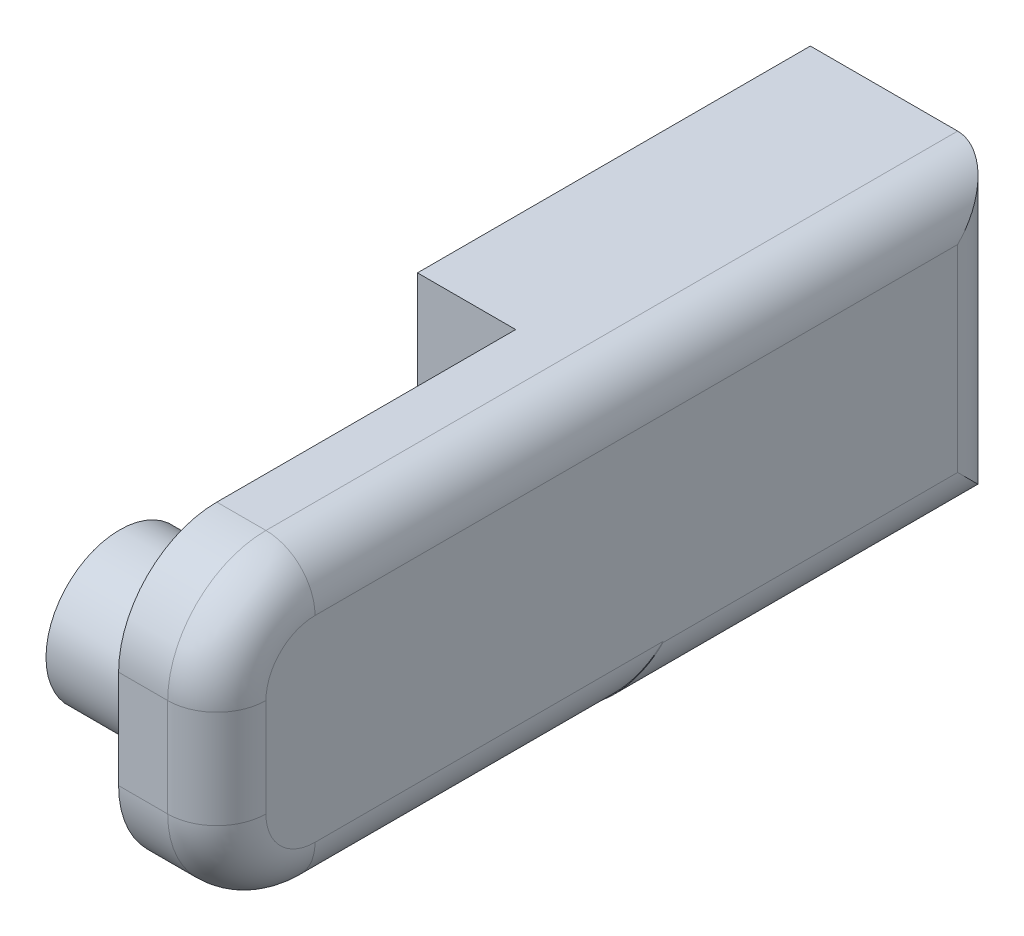
ISO-10303-21;
HEADER;
FILE_DESCRIPTION(('STEP AP214'),'2;1');
FILE_NAME('part.step','',(''),(''),'','','');
FILE_SCHEMA(('AUTOMOTIVE_DESIGN { 1 0 10303 214 1 1 1 1 }'));
ENDSEC;
DATA;
#1=APPLICATION_CONTEXT('core data for automotive mechanical design processes');
#2=APPLICATION_PROTOCOL_DEFINITION('international standard','automotive_design',2000,#1);
#3=PRODUCT_CONTEXT('',#1,'mechanical');
#4=PRODUCT('Part','Part','',(#3));
#5=PRODUCT_RELATED_PRODUCT_CATEGORY('part','',(#4));
#6=PRODUCT_DEFINITION_FORMATION('','',#4);
#7=PRODUCT_DEFINITION_CONTEXT('part definition',#1,'design');
#8=PRODUCT_DEFINITION('design','',#6,#7);
#9=PRODUCT_DEFINITION_SHAPE('','',#8);
#10=(LENGTH_UNIT() NAMED_UNIT(*) SI_UNIT(.MILLI.,.METRE.));
#11=(NAMED_UNIT(*) PLANE_ANGLE_UNIT() SI_UNIT($,.RADIAN.));
#12=(NAMED_UNIT(*) SI_UNIT($,.STERADIAN.) SOLID_ANGLE_UNIT());
#13=UNCERTAINTY_MEASURE_WITH_UNIT(LENGTH_MEASURE(1.E-05),#10,'distance_accuracy_value','');
#14=(GEOMETRIC_REPRESENTATION_CONTEXT(3) GLOBAL_UNCERTAINTY_ASSIGNED_CONTEXT((#13)) GLOBAL_UNIT_ASSIGNED_CONTEXT((#10,
#11,#12)) REPRESENTATION_CONTEXT('',''));
#15=CARTESIAN_POINT('',(0.,0.,0.));
#16=DIRECTION('',(0.,0.,1.));
#17=DIRECTION('',(1.,0.,0.));
#18=AXIS2_PLACEMENT_3D('',#15,#16,#17);
#19=CARTESIAN_POINT('',(-20.,0.,10.1076923076923));
#20=DIRECTION('',(1.,0.,0.));
#21=DIRECTION('',(0.,0.,-1.));
#22=AXIS2_PLACEMENT_3D('',#19,#20,#21);
#23=CYLINDRICAL_SURFACE('',#22,7.5);
#24=CARTESIAN_POINT('',(0.,0.,10.1076923076923));
#25=DIRECTION('',(1.,0.,0.));
#26=DIRECTION('',(0.,0.,-1.));
#27=AXIS2_PLACEMENT_3D('',#24,#25,#26);
#28=CIRCLE('',#27,7.5);
#29=CARTESIAN_POINT('',(0.,0.,2.60769230769231));
#30=VERTEX_POINT('',#29);
#31=EDGE_CURVE('E184',#30,#30,#28,.F.);
#32=ORIENTED_EDGE('',*,*,#31,.T.);
#33=EDGE_LOOP('',(#32));
#34=FACE_BOUND('',#33,.T.);
#35=CARTESIAN_POINT('',(-10.,0.,10.1076923076923));
#36=DIRECTION('',(-1.,0.,0.));
#37=DIRECTION('',(0.,0.,1.));
#38=AXIS2_PLACEMENT_3D('',#35,#36,#37);
#39=CIRCLE('',#38,7.5);
#40=CARTESIAN_POINT('',(-10.,0.,17.6076923076923));
#41=VERTEX_POINT('',#40);
#42=EDGE_CURVE('E151',#41,#41,#39,.T.);
#43=ORIENTED_EDGE('',*,*,#42,.F.);
#44=EDGE_LOOP('',(#43));
#45=FACE_BOUND('',#44,.T.);
#46=ADVANCED_FACE('F35',(#34,#45),#23,.T.);
#47=CARTESIAN_POINT('',(10.,15.,20.2153846153846));
#48=DIRECTION('',(0.,-1.,0.));
#49=DIRECTION('',(0.,0.,-1.));
#50=AXIS2_PLACEMENT_3D('',#47,#48,#49);
#51=PLANE('',#50);
#52=DIRECTION('',(-1.,0.,0.));
#53=VECTOR('',#52,1.);
#54=CARTESIAN_POINT('',(10.,15.,10.2153846153846));
#55=LINE('',#54,#53);
#56=CARTESIAN_POINT('',(0.,15.,10.2153846153846));
#57=VERTEX_POINT('',#56);
#58=CARTESIAN_POINT('',(5.,15.,10.2153846153846));
#59=VERTEX_POINT('',#58);
#60=EDGE_CURVE('E197',#57,#59,#55,.F.);
#61=ORIENTED_EDGE('',*,*,#60,.T.);
#62=DIRECTION('',(0.,0.,1.));
#63=VECTOR('',#62,1.);
#64=CARTESIAN_POINT('',(5.,15.,-60.2153846153846));
#65=LINE('',#64,#63);
#66=CARTESIAN_POINT('',(5.,15.,-60.2153846153846));
#67=VERTEX_POINT('',#66);
#68=EDGE_CURVE('E220',#59,#67,#65,.F.);
#69=ORIENTED_EDGE('',*,*,#68,.T.);
#70=DIRECTION('',(1.,0.,0.));
#71=VECTOR('',#70,1.);
#72=CARTESIAN_POINT('',(10.,15.,-60.2153846153846));
#73=LINE('',#72,#71);
#74=CARTESIAN_POINT('',(-10.,15.,-60.2153846153846));
#75=VERTEX_POINT('',#74);
#76=EDGE_CURVE('E157',#75,#67,#73,.T.);
#77=ORIENTED_EDGE('',*,*,#76,.F.);
#78=DIRECTION('',(0.,0.,1.));
#79=VECTOR('',#78,1.);
#80=CARTESIAN_POINT('',(-10.,15.,-60.2153846153846));
#81=LINE('',#80,#79);
#82=CARTESIAN_POINT('',(-10.,15.,-20.2153846153846));
#83=VERTEX_POINT('',#82);
#84=EDGE_CURVE('E152',#75,#83,#81,.T.);
#85=ORIENTED_EDGE('',*,*,#84,.T.);
#86=DIRECTION('',(1.,0.,0.));
#87=VECTOR('',#86,1.);
#88=CARTESIAN_POINT('',(10.,15.,-20.2153846153846));
#89=LINE('',#88,#87);
#90=CARTESIAN_POINT('',(0.,15.,-20.2153846153846));
#91=VERTEX_POINT('',#90);
#92=EDGE_CURVE('E142',#83,#91,#89,.T.);
#93=ORIENTED_EDGE('',*,*,#92,.T.);
#94=DIRECTION('',(0.,0.,1.));
#95=VECTOR('',#94,1.);
#96=CARTESIAN_POINT('',(0.,15.,20.2153846153846));
#97=LINE('',#96,#95);
#98=EDGE_CURVE('E173',#91,#57,#97,.T.);
#99=ORIENTED_EDGE('',*,*,#98,.T.);
#100=EDGE_LOOP('',(#61,#69,#77,#85,#93,#99));
#101=FACE_BOUND('',#100,.T.);
#102=ADVANCED_FACE('F270',(#101),#51,.F.);
#103=CARTESIAN_POINT('',(10.,15.,20.2153846153846));
#104=DIRECTION('',(0.,0.,-1.));
#105=DIRECTION('',(-1.,0.,0.));
#106=AXIS2_PLACEMENT_3D('',#103,#104,#105);
#107=PLANE('',#106);
#108=DIRECTION('',(-1.,0.,0.));
#109=VECTOR('',#108,1.);
#110=CARTESIAN_POINT('',(10.,-5.,20.2153846153846));
#111=LINE('',#110,#109);
#112=CARTESIAN_POINT('',(0.,-5.,20.2153846153846));
#113=VERTEX_POINT('',#112);
#114=CARTESIAN_POINT('',(5.,-5.,20.2153846153846));
#115=VERTEX_POINT('',#114);
#116=EDGE_CURVE('E195',#113,#115,#111,.F.);
#117=ORIENTED_EDGE('',*,*,#116,.T.);
#118=DIRECTION('',(0.,-1.,0.));
#119=VECTOR('',#118,1.);
#120=CARTESIAN_POINT('',(5.,5.,20.2153846153846));
#121=LINE('',#120,#119);
#122=CARTESIAN_POINT('',(5.,5.,20.2153846153846));
#123=VERTEX_POINT('',#122);
#124=EDGE_CURVE('E11',#115,#123,#121,.F.);
#125=ORIENTED_EDGE('',*,*,#124,.T.);
#126=DIRECTION('',(-1.,0.,0.));
#127=VECTOR('',#126,1.);
#128=CARTESIAN_POINT('',(10.,5.,20.2153846153846));
#129=LINE('',#128,#127);
#130=CARTESIAN_POINT('',(0.,5.,20.2153846153846));
#131=VERTEX_POINT('',#130);
#132=EDGE_CURVE('E193',#123,#131,#129,.T.);
#133=ORIENTED_EDGE('',*,*,#132,.T.);
#134=DIRECTION('',(0.,-1.,0.));
#135=VECTOR('',#134,1.);
#136=CARTESIAN_POINT('',(0.,15.,20.2153846153846));
#137=LINE('',#136,#135);
#138=EDGE_CURVE('E176',#131,#113,#137,.T.);
#139=ORIENTED_EDGE('',*,*,#138,.T.);
#140=EDGE_LOOP('',(#117,#125,#133,#139));
#141=FACE_BOUND('',#140,.T.);
#142=ADVANCED_FACE('F297',(#141),#107,.F.);
#143=CARTESIAN_POINT('',(10.,-15.,20.2153846153846));
#144=DIRECTION('',(0.,1.,0.));
#145=DIRECTION('',(0.,0.,1.));
#146=AXIS2_PLACEMENT_3D('',#143,#144,#145);
#147=PLANE('',#146);
#148=DIRECTION('',(-1.,0.,0.));
#149=VECTOR('',#148,1.);
#150=CARTESIAN_POINT('',(10.,-15.,-20.2153846153846));
#151=LINE('',#150,#149);
#152=CARTESIAN_POINT('',(5.,-15.,-20.2153846153846));
#153=VERTEX_POINT('',#152);
#154=CARTESIAN_POINT('',(0.,-15.,-20.2153846153846));
#155=VERTEX_POINT('',#154);
#156=EDGE_CURVE('E182',#153,#155,#151,.T.);
#157=ORIENTED_EDGE('',*,*,#156,.F.);
#158=DIRECTION('',(0.,0.,-1.));
#159=VECTOR('',#158,1.);
#160=CARTESIAN_POINT('',(5.,-15.,10.2153846153846));
#161=LINE('',#160,#159);
#162=CARTESIAN_POINT('',(5.,-15.,10.2153846153846));
#163=VERTEX_POINT('',#162);
#164=EDGE_CURVE('E59',#153,#163,#161,.F.);
#165=ORIENTED_EDGE('',*,*,#164,.T.);
#166=DIRECTION('',(-1.,0.,0.));
#167=VECTOR('',#166,1.);
#168=CARTESIAN_POINT('',(10.,-15.,10.2153846153846));
#169=LINE('',#168,#167);
#170=CARTESIAN_POINT('',(0.,-15.,10.2153846153846));
#171=VERTEX_POINT('',#170);
#172=EDGE_CURVE('E187',#163,#171,#169,.T.);
#173=ORIENTED_EDGE('',*,*,#172,.T.);
#174=DIRECTION('',(0.,0.,-1.));
#175=VECTOR('',#174,1.);
#176=CARTESIAN_POINT('',(0.,-15.,20.2153846153846));
#177=LINE('',#176,#175);
#178=EDGE_CURVE('E179',#171,#155,#177,.T.);
#179=ORIENTED_EDGE('',*,*,#178,.T.);
#180=EDGE_LOOP('',(#157,#165,#173,#179));
#181=FACE_BOUND('',#180,.T.);
#182=ADVANCED_FACE('F262',(#181),#147,.F.);
#183=CARTESIAN_POINT('',(10.,0.,0.));
#184=DIRECTION('',(1.,0.,0.));
#185=DIRECTION('',(0.,0.,-1.));
#186=AXIS2_PLACEMENT_3D('',#183,#184,#185);
#187=PLANE('',#186);
#188=DIRECTION('',(0.,0.,1.));
#189=VECTOR('',#188,1.);
#190=CARTESIAN_POINT('',(10.,10.,10.2153846153846));
#191=LINE('',#190,#189);
#192=CARTESIAN_POINT('',(10.,10.,-55.2153846153846));
#193=VERTEX_POINT('',#192);
#194=CARTESIAN_POINT('',(10.,10.,10.2153846153846));
#195=VERTEX_POINT('',#194);
#196=EDGE_CURVE('E212',#193,#195,#191,.T.);
#197=ORIENTED_EDGE('',*,*,#196,.T.);
#198=CARTESIAN_POINT('',(10.,5.,10.2153846153846));
#199=DIRECTION('',(1.,0.,0.));
#200=DIRECTION('',(0.,0.,-1.));
#201=AXIS2_PLACEMENT_3D('',#198,#199,#200);
#202=CIRCLE('',#201,5.);
#203=CARTESIAN_POINT('',(10.,5.,15.2153846153846));
#204=VERTEX_POINT('',#203);
#205=EDGE_CURVE('E214',#195,#204,#202,.T.);
#206=ORIENTED_EDGE('',*,*,#205,.T.);
#207=DIRECTION('',(0.,-1.,0.));
#208=VECTOR('',#207,1.);
#209=CARTESIAN_POINT('',(10.,-5.,15.2153846153846));
#210=LINE('',#209,#208);
#211=CARTESIAN_POINT('',(10.,-5.,15.2153846153846));
#212=VERTEX_POINT('',#211);
#213=EDGE_CURVE('E200',#204,#212,#210,.T.);
#214=ORIENTED_EDGE('',*,*,#213,.T.);
#215=CARTESIAN_POINT('',(10.,-5.,10.2153846153846));
#216=DIRECTION('',(1.,0.,0.));
#217=DIRECTION('',(0.,0.,-1.));
#218=AXIS2_PLACEMENT_3D('',#215,#216,#217);
#219=CIRCLE('',#218,5.);
#220=CARTESIAN_POINT('',(10.,-10.,10.2153846153846));
#221=VERTEX_POINT('',#220);
#222=EDGE_CURVE('E202',#212,#221,#219,.T.);
#223=ORIENTED_EDGE('',*,*,#222,.T.);
#224=DIRECTION('',(0.,0.,-1.));
#225=VECTOR('',#224,1.);
#226=CARTESIAN_POINT('',(10.,-10.,-20.2153846153846));
#227=LINE('',#226,#225);
#228=CARTESIAN_POINT('',(10.,-10.,-25.2153846153846));
#229=VERTEX_POINT('',#228);
#230=EDGE_CURVE('E204',#221,#229,#227,.T.);
#231=ORIENTED_EDGE('',*,*,#230,.T.);
#232=DIRECTION('',(0.,-1.,0.));
#233=VECTOR('',#232,1.);
#234=CARTESIAN_POINT('',(10.,-15.1023626646417,-25.2153846153846));
#235=LINE('',#234,#233);
#236=CARTESIAN_POINT('',(10.,-10.1023626646417,-25.2153846153846));
#237=VERTEX_POINT('',#236);
#238=EDGE_CURVE('E206',#229,#237,#235,.T.);
#239=ORIENTED_EDGE('',*,*,#238,.T.);
#240=DIRECTION('',(0.,0.,1.));
#241=VECTOR('',#240,1.);
#242=CARTESIAN_POINT('',(10.,-10.1023626646417,-60.2153846153846));
#243=LINE('',#242,#241);
#244=CARTESIAN_POINT('',(10.,-10.1023626646417,-55.2153846153846));
#245=VERTEX_POINT('',#244);
#246=EDGE_CURVE('E208',#237,#245,#243,.F.);
#247=ORIENTED_EDGE('',*,*,#246,.T.);
#248=DIRECTION('',(0.,-1.,0.));
#249=VECTOR('',#248,1.);
#250=CARTESIAN_POINT('',(10.,0.,-55.2153846153846));
#251=LINE('',#250,#249);
#252=EDGE_CURVE('E210',#245,#193,#251,.F.);
#253=ORIENTED_EDGE('',*,*,#252,.T.);
#254=EDGE_LOOP('',(#197,#206,#214,#223,#231,#239,#247,#253));
#255=FACE_BOUND('',#254,.T.);
#256=ADVANCED_FACE('F283',(#255),#187,.T.);
#257=CARTESIAN_POINT('',(0.,0.,0.));
#258=DIRECTION('',(1.,0.,0.));
#259=DIRECTION('',(0.,0.,-1.));
#260=AXIS2_PLACEMENT_3D('',#257,#258,#259);
#261=PLANE('',#260);
#262=ORIENTED_EDGE('',*,*,#31,.F.);
#263=EDGE_LOOP('',(#262));
#264=FACE_BOUND('',#263,.T.);
#265=ORIENTED_EDGE('',*,*,#178,.F.);
#266=CARTESIAN_POINT('',(0.,-5.,10.2153846153846));
#267=DIRECTION('',(1.,0.,0.));
#268=DIRECTION('',(0.,0.,-1.));
#269=AXIS2_PLACEMENT_3D('',#266,#267,#268);
#270=CIRCLE('',#269,10.);
#271=EDGE_CURVE('E191',#171,#113,#270,.F.);
#272=ORIENTED_EDGE('',*,*,#271,.T.);
#273=ORIENTED_EDGE('',*,*,#138,.F.);
#274=CARTESIAN_POINT('',(0.,5.,10.2153846153846));
#275=DIRECTION('',(1.,0.,0.));
#276=DIRECTION('',(0.,0.,-1.));
#277=AXIS2_PLACEMENT_3D('',#274,#275,#276);
#278=CIRCLE('',#277,10.);
#279=EDGE_CURVE('E189',#131,#57,#278,.F.);
#280=ORIENTED_EDGE('',*,*,#279,.T.);
#281=ORIENTED_EDGE('',*,*,#98,.F.);
#282=DIRECTION('',(0.,1.,0.));
#283=VECTOR('',#282,1.);
#284=CARTESIAN_POINT('',(0.,15.,-20.2153846153846));
#285=LINE('',#284,#283);
#286=EDGE_CURVE('E170',#155,#91,#285,.T.);
#287=ORIENTED_EDGE('',*,*,#286,.F.);
#288=EDGE_LOOP('',(#265,#272,#273,#280,#281,#287));
#289=FACE_BOUND('',#288,.T.);
#290=ADVANCED_FACE('F266',(#264,#289),#261,.F.);
#291=CARTESIAN_POINT('',(10.,-5.,10.2153846153846));
#292=DIRECTION('',(-1.,0.,0.));
#293=DIRECTION('',(0.,0.,1.));
#294=AXIS2_PLACEMENT_3D('',#291,#292,#293);
#295=CYLINDRICAL_SURFACE('',#294,10.);
#296=ORIENTED_EDGE('',*,*,#172,.F.);
#297=CARTESIAN_POINT('',(5.,-5.,10.2153846153846));
#298=DIRECTION('',(1.,0.,0.));
#299=DIRECTION('',(0.,0.,-1.));
#300=AXIS2_PLACEMENT_3D('',#297,#298,#299);
#301=CIRCLE('',#300,10.);
#302=EDGE_CURVE('E44',#163,#115,#301,.F.);
#303=ORIENTED_EDGE('',*,*,#302,.T.);
#304=ORIENTED_EDGE('',*,*,#116,.F.);
#305=ORIENTED_EDGE('',*,*,#271,.F.);
#306=EDGE_LOOP('',(#296,#303,#304,#305));
#307=FACE_BOUND('',#306,.T.);
#308=ADVANCED_FACE('F333',(#307),#295,.T.);
#309=CARTESIAN_POINT('',(10.,5.,10.2153846153846));
#310=DIRECTION('',(-1.,0.,0.));
#311=DIRECTION('',(0.,0.,1.));
#312=AXIS2_PLACEMENT_3D('',#309,#310,#311);
#313=CYLINDRICAL_SURFACE('',#312,10.);
#314=ORIENTED_EDGE('',*,*,#132,.F.);
#315=CARTESIAN_POINT('',(5.,5.,10.2153846153846));
#316=DIRECTION('',(1.,0.,0.));
#317=DIRECTION('',(0.,0.,-1.));
#318=AXIS2_PLACEMENT_3D('',#315,#316,#317);
#319=CIRCLE('',#318,10.);
#320=EDGE_CURVE('E217',#123,#59,#319,.F.);
#321=ORIENTED_EDGE('',*,*,#320,.T.);
#322=ORIENTED_EDGE('',*,*,#60,.F.);
#323=ORIENTED_EDGE('',*,*,#279,.F.);
#324=EDGE_LOOP('',(#314,#321,#322,#323));
#325=FACE_BOUND('',#324,.T.);
#326=ADVANCED_FACE('F301',(#325),#313,.T.);
#327=CARTESIAN_POINT('',(-10.,0.,10.1076923076923));
#328=DIRECTION('',(-1.,0.,0.));
#329=DIRECTION('',(0.,0.,1.));
#330=AXIS2_PLACEMENT_3D('',#327,#328,#329);
#331=PLANE('',#330);
#332=ORIENTED_EDGE('',*,*,#42,.T.);
#333=EDGE_LOOP('',(#332));
#334=FACE_BOUND('',#333,.T.);
#335=ADVANCED_FACE('F327',(#334),#331,.T.);
#336=CARTESIAN_POINT('',(0.,0.,-20.2153846153846));
#337=DIRECTION('',(0.,0.,-1.));
#338=DIRECTION('',(-1.,0.,0.));
#339=AXIS2_PLACEMENT_3D('',#336,#337,#338);
#340=PLANE('',#339);
#341=DIRECTION('',(-1.,0.,0.));
#342=VECTOR('',#341,1.);
#343=CARTESIAN_POINT('',(10.,-15.1023626646417,-20.2153846153846));
#344=LINE('',#343,#342);
#345=CARTESIAN_POINT('',(5.,-15.1023626646417,-20.2153846153846));
#346=VERTEX_POINT('',#345);
#347=CARTESIAN_POINT('',(-10.,-15.1023626646417,-20.2153846153846));
#348=VERTEX_POINT('',#347);
#349=EDGE_CURVE('E148',#346,#348,#344,.T.);
#350=ORIENTED_EDGE('',*,*,#349,.F.);
#351=DIRECTION('',(0.,-1.,0.));
#352=VECTOR('',#351,1.);
#353=CARTESIAN_POINT('',(5.,-15.,-20.2153846153846));
#354=LINE('',#353,#352);
#355=EDGE_CURVE('E225',#346,#153,#354,.F.);
#356=ORIENTED_EDGE('',*,*,#355,.T.);
#357=ORIENTED_EDGE('',*,*,#156,.T.);
#358=ORIENTED_EDGE('',*,*,#286,.T.);
#359=ORIENTED_EDGE('',*,*,#92,.F.);
#360=DIRECTION('',(0.,1.,0.));
#361=VECTOR('',#360,1.);
#362=CARTESIAN_POINT('',(-10.,15.,-20.2153846153846));
#363=LINE('',#362,#361);
#364=EDGE_CURVE('E163',#348,#83,#363,.T.);
#365=ORIENTED_EDGE('',*,*,#364,.F.);
#366=EDGE_LOOP('',(#350,#356,#357,#358,#359,#365));
#367=FACE_BOUND('',#366,.T.);
#368=ADVANCED_FACE('F260',(#367),#340,.F.);
#369=CARTESIAN_POINT('',(10.,-15.1023626646417,-60.2153846153846));
#370=DIRECTION('',(0.,1.,0.));
#371=DIRECTION('',(0.,0.,1.));
#372=AXIS2_PLACEMENT_3D('',#369,#370,#371);
#373=PLANE('',#372);
#374=DIRECTION('',(-1.,0.,0.));
#375=VECTOR('',#374,1.);
#376=CARTESIAN_POINT('',(10.,-15.1023626646417,-60.2153846153846));
#377=LINE('',#376,#375);
#378=CARTESIAN_POINT('',(5.,-15.1023626646417,-60.2153846153846));
#379=VERTEX_POINT('',#378);
#380=CARTESIAN_POINT('',(-10.,-15.1023626646417,-60.2153846153846));
#381=VERTEX_POINT('',#380);
#382=EDGE_CURVE('E131',#379,#381,#377,.T.);
#383=ORIENTED_EDGE('',*,*,#382,.F.);
#384=DIRECTION('',(0.,0.,1.));
#385=VECTOR('',#384,1.);
#386=CARTESIAN_POINT('',(5.,-15.1023626646417,-20.2153846153846));
#387=LINE('',#386,#385);
#388=EDGE_CURVE('E223',#379,#346,#387,.T.);
#389=ORIENTED_EDGE('',*,*,#388,.T.);
#390=ORIENTED_EDGE('',*,*,#349,.T.);
#391=DIRECTION('',(0.,0.,1.));
#392=VECTOR('',#391,1.);
#393=CARTESIAN_POINT('',(-10.,-15.1023626646417,-60.2153846153846));
#394=LINE('',#393,#392);
#395=EDGE_CURVE('E145',#381,#348,#394,.T.);
#396=ORIENTED_EDGE('',*,*,#395,.F.);
#397=EDGE_LOOP('',(#383,#389,#390,#396));
#398=FACE_BOUND('',#397,.T.);
#399=ADVANCED_FACE('F146',(#398),#373,.F.);
#400=CARTESIAN_POINT('',(-10.,15.,-60.2153846153846));
#401=DIRECTION('',(1.,0.,0.));
#402=DIRECTION('',(0.,1.,0.));
#403=AXIS2_PLACEMENT_3D('',#400,#401,#402);
#404=PLANE('',#403);
#405=ORIENTED_EDGE('',*,*,#364,.T.);
#406=ORIENTED_EDGE('',*,*,#84,.F.);
#407=DIRECTION('',(0.,1.,0.));
#408=VECTOR('',#407,1.);
#409=CARTESIAN_POINT('',(-10.,15.,-60.2153846153846));
#410=LINE('',#409,#408);
#411=EDGE_CURVE('E136',#381,#75,#410,.T.);
#412=ORIENTED_EDGE('',*,*,#411,.F.);
#413=ORIENTED_EDGE('',*,*,#395,.T.);
#414=EDGE_LOOP('',(#405,#406,#412,#413));
#415=FACE_BOUND('',#414,.T.);
#416=ADVANCED_FACE('F154',(#415),#404,.F.);
#417=CARTESIAN_POINT('',(0.,0.,-60.2153846153846));
#418=DIRECTION('',(0.,0.,-1.));
#419=DIRECTION('',(-1.,0.,0.));
#420=AXIS2_PLACEMENT_3D('',#417,#418,#419);
#421=PLANE('',#420);
#422=CARTESIAN_POINT('',(-2.5,-0.0511813323208349,-60.2153846153846));
#423=DIRECTION('',(0.,0.,-1.));
#424=DIRECTION('',(-1.,0.,0.));
#425=AXIS2_PLACEMENT_3D('',#422,#423,#424);
#426=CIRCLE('',#425,5.);
#427=CARTESIAN_POINT('',(-7.5,-0.0511813323208349,-60.2153846153846));
#428=VERTEX_POINT('',#427);
#429=EDGE_CURVE('E364',#428,#428,#426,.T.);
#430=ORIENTED_EDGE('',*,*,#429,.F.);
#431=EDGE_LOOP('',(#430));
#432=FACE_BOUND('',#431,.T.);
#433=ORIENTED_EDGE('',*,*,#76,.T.);
#434=DIRECTION('',(0.,-1.,0.));
#435=VECTOR('',#434,1.);
#436=CARTESIAN_POINT('',(5.,0.,-60.2153846153846));
#437=LINE('',#436,#435);
#438=EDGE_CURVE('E139',#67,#379,#437,.T.);
#439=ORIENTED_EDGE('',*,*,#438,.T.);
#440=ORIENTED_EDGE('',*,*,#382,.T.);
#441=ORIENTED_EDGE('',*,*,#411,.T.);
#442=EDGE_LOOP('',(#433,#439,#440,#441));
#443=FACE_BOUND('',#442,.T.);
#444=ADVANCED_FACE('F134',(#432,#443),#421,.T.);
#445=CARTESIAN_POINT('',(5.,0.,-25.2153846153846));
#446=DIRECTION('',(0.,1.,0.));
#447=DIRECTION('',(0.,0.,1.));
#448=AXIS2_PLACEMENT_3D('',#445,#446,#447);
#449=CYLINDRICAL_SURFACE('',#448,5.);
#450=CARTESIAN_POINT('',(5.,-10.,-25.2153846153846));
#451=DIRECTION('',(0.,0.707106781186547,0.707106781186547));
#452=DIRECTION('',(0.,0.707106781186547,-0.707106781186547));
#453=AXIS2_PLACEMENT_3D('',#450,#451,#452);
#454=ELLIPSE('',#453,7.07106781186547,5.);
#455=EDGE_CURVE('E245',#153,#229,#454,.T.);
#456=ORIENTED_EDGE('',*,*,#455,.F.);
#457=ORIENTED_EDGE('',*,*,#355,.F.);
#458=CARTESIAN_POINT('',(5.,-10.1023626646417,-25.2153846153846));
#459=DIRECTION('',(0.,0.707106781186547,0.707106781186547));
#460=DIRECTION('',(0.,0.707106781186547,-0.707106781186547));
#461=AXIS2_PLACEMENT_3D('',#458,#459,#460);
#462=ELLIPSE('',#461,7.07106781186547,5.);
#463=EDGE_CURVE('E39',#237,#346,#462,.F.);
#464=ORIENTED_EDGE('',*,*,#463,.F.);
#465=ORIENTED_EDGE('',*,*,#238,.F.);
#466=EDGE_LOOP('',(#456,#457,#464,#465));
#467=FACE_BOUND('',#466,.T.);
#468=ADVANCED_FACE('F37',(#467),#449,.T.);
#469=CARTESIAN_POINT('',(5.,-10.1023626646417,-60.2153846153846));
#470=DIRECTION('',(0.,0.,-1.));
#471=DIRECTION('',(-1.,0.,0.));
#472=AXIS2_PLACEMENT_3D('',#469,#470,#471);
#473=CYLINDRICAL_SURFACE('',#472,5.);
#474=ORIENTED_EDGE('',*,*,#463,.T.);
#475=ORIENTED_EDGE('',*,*,#388,.F.);
#476=CARTESIAN_POINT('',(5.,-10.1023626646417,-55.2153846153846));
#477=DIRECTION('',(0.,0.707106781186547,-0.707106781186547));
#478=DIRECTION('',(0.,-0.707106781186547,-0.707106781186547));
#479=AXIS2_PLACEMENT_3D('',#476,#477,#478);
#480=ELLIPSE('',#479,7.07106781186547,5.);
#481=EDGE_CURVE('E243',#245,#379,#480,.T.);
#482=ORIENTED_EDGE('',*,*,#481,.F.);
#483=ORIENTED_EDGE('',*,*,#246,.F.);
#484=EDGE_LOOP('',(#474,#475,#482,#483));
#485=FACE_BOUND('',#484,.T.);
#486=ADVANCED_FACE('F254',(#485),#473,.T.);
#487=CARTESIAN_POINT('',(5.,-10.,0.));
#488=DIRECTION('',(0.,0.,1.));
#489=DIRECTION('',(1.,0.,0.));
#490=AXIS2_PLACEMENT_3D('',#487,#488,#489);
#491=CYLINDRICAL_SURFACE('',#490,5.);
#492=ORIENTED_EDGE('',*,*,#455,.T.);
#493=ORIENTED_EDGE('',*,*,#230,.F.);
#494=CARTESIAN_POINT('',(5.,-10.,10.2153846153846));
#495=DIRECTION('',(0.,0.,1.));
#496=DIRECTION('',(1.,0.,0.));
#497=AXIS2_PLACEMENT_3D('',#494,#495,#496);
#498=CIRCLE('',#497,5.);
#499=EDGE_CURVE('E240',#163,#221,#498,.T.);
#500=ORIENTED_EDGE('',*,*,#499,.F.);
#501=ORIENTED_EDGE('',*,*,#164,.F.);
#502=EDGE_LOOP('',(#492,#493,#500,#501));
#503=FACE_BOUND('',#502,.T.);
#504=ADVANCED_FACE('F286',(#503),#491,.T.);
#505=CARTESIAN_POINT('',(5.,0.,-55.2153846153846));
#506=DIRECTION('',(0.,-1.,0.));
#507=DIRECTION('',(0.,0.,-1.));
#508=AXIS2_PLACEMENT_3D('',#505,#506,#507);
#509=CYLINDRICAL_SURFACE('',#508,5.);
#510=ORIENTED_EDGE('',*,*,#481,.T.);
#511=ORIENTED_EDGE('',*,*,#438,.F.);
#512=CARTESIAN_POINT('',(5.,10.,-55.2153846153846));
#513=DIRECTION('',(0.,-0.707106781186547,-0.707106781186547));
#514=DIRECTION('',(0.,-0.707106781186547,0.707106781186547));
#515=AXIS2_PLACEMENT_3D('',#512,#513,#514);
#516=ELLIPSE('',#515,7.07106781186547,5.);
#517=EDGE_CURVE('E237',#193,#67,#516,.F.);
#518=ORIENTED_EDGE('',*,*,#517,.F.);
#519=ORIENTED_EDGE('',*,*,#252,.F.);
#520=EDGE_LOOP('',(#510,#511,#518,#519));
#521=FACE_BOUND('',#520,.T.);
#522=ADVANCED_FACE('F275',(#521),#509,.T.);
#523=CARTESIAN_POINT('',(5.,-5.,10.2153846153846));
#524=DIRECTION('',(1.,0.,0.));
#525=DIRECTION('',(0.,0.,-1.));
#526=AXIS2_PLACEMENT_3D('',#523,#524,#525);
#527=DEGENERATE_TOROIDAL_SURFACE('',#526,5.,5.,.T.);
#528=ORIENTED_EDGE('',*,*,#499,.T.);
#529=ORIENTED_EDGE('',*,*,#222,.F.);
#530=CARTESIAN_POINT('',(5.,-5.,15.2153846153846));
#531=DIRECTION('',(0.,1.,0.));
#532=DIRECTION('',(0.,0.,1.));
#533=AXIS2_PLACEMENT_3D('',#530,#531,#532);
#534=CIRCLE('',#533,5.);
#535=EDGE_CURVE('E234',#115,#212,#534,.T.);
#536=ORIENTED_EDGE('',*,*,#535,.F.);
#537=ORIENTED_EDGE('',*,*,#302,.F.);
#538=EDGE_LOOP('',(#528,#529,#536,#537));
#539=FACE_BOUND('',#538,.T.);
#540=ADVANCED_FACE('F288',(#539),#527,.T.);
#541=CARTESIAN_POINT('',(5.,10.,0.));
#542=DIRECTION('',(0.,0.,-1.));
#543=DIRECTION('',(-1.,0.,0.));
#544=AXIS2_PLACEMENT_3D('',#541,#542,#543);
#545=CYLINDRICAL_SURFACE('',#544,5.);
#546=ORIENTED_EDGE('',*,*,#517,.T.);
#547=ORIENTED_EDGE('',*,*,#68,.F.);
#548=CARTESIAN_POINT('',(5.,10.,10.2153846153846));
#549=DIRECTION('',(0.,0.,1.));
#550=DIRECTION('',(1.,0.,0.));
#551=AXIS2_PLACEMENT_3D('',#548,#549,#550);
#552=CIRCLE('',#551,5.);
#553=EDGE_CURVE('E231',#195,#59,#552,.T.);
#554=ORIENTED_EDGE('',*,*,#553,.F.);
#555=ORIENTED_EDGE('',*,*,#196,.F.);
#556=EDGE_LOOP('',(#546,#547,#554,#555));
#557=FACE_BOUND('',#556,.T.);
#558=ADVANCED_FACE('F279',(#557),#545,.T.);
#559=CARTESIAN_POINT('',(5.,0.,15.2153846153846));
#560=DIRECTION('',(0.,1.,0.));
#561=DIRECTION('',(0.,0.,1.));
#562=AXIS2_PLACEMENT_3D('',#559,#560,#561);
#563=CYLINDRICAL_SURFACE('',#562,5.);
#564=ORIENTED_EDGE('',*,*,#535,.T.);
#565=ORIENTED_EDGE('',*,*,#213,.F.);
#566=CARTESIAN_POINT('',(5.,5.,15.2153846153846));
#567=DIRECTION('',(0.,1.,0.));
#568=DIRECTION('',(0.,0.,1.));
#569=AXIS2_PLACEMENT_3D('',#566,#567,#568);
#570=CIRCLE('',#569,5.);
#571=EDGE_CURVE('E229',#123,#204,#570,.T.);
#572=ORIENTED_EDGE('',*,*,#571,.F.);
#573=ORIENTED_EDGE('',*,*,#124,.F.);
#574=EDGE_LOOP('',(#564,#565,#572,#573));
#575=FACE_BOUND('',#574,.T.);
#576=ADVANCED_FACE('F294',(#575),#563,.T.);
#577=CARTESIAN_POINT('',(5.,5.,10.2153846153846));
#578=DIRECTION('',(1.,0.,0.));
#579=DIRECTION('',(0.,0.,-1.));
#580=AXIS2_PLACEMENT_3D('',#577,#578,#579);
#581=DEGENERATE_TOROIDAL_SURFACE('',#580,5.,5.,.T.);
#582=ORIENTED_EDGE('',*,*,#553,.T.);
#583=ORIENTED_EDGE('',*,*,#320,.F.);
#584=ORIENTED_EDGE('',*,*,#571,.T.);
#585=ORIENTED_EDGE('',*,*,#205,.F.);
#586=EDGE_LOOP('',(#582,#583,#584,#585));
#587=FACE_BOUND('',#586,.T.);
#588=ADVANCED_FACE('F303',(#587),#581,.T.);
#589=CARTESIAN_POINT('',(-2.5,-0.0511813323208349,-50.2153846153846));
#590=DIRECTION('',(0.,0.,-1.));
#591=DIRECTION('',(-1.,0.,0.));
#592=AXIS2_PLACEMENT_3D('',#589,#590,#591);
#593=CYLINDRICAL_SURFACE('',#592,5.);
#594=CARTESIAN_POINT('',(-2.5,-0.0511813323208349,-50.2153846153846));
#595=DIRECTION('',(0.,0.,-1.));
#596=DIRECTION('',(-1.,0.,0.));
#597=AXIS2_PLACEMENT_3D('',#594,#595,#596);
#598=CIRCLE('',#597,5.);
#599=CARTESIAN_POINT('',(-7.5,-0.0511813323208349,-50.2153846153846));
#600=VERTEX_POINT('',#599);
#601=EDGE_CURVE('E232',#600,#600,#598,.T.);
#602=ORIENTED_EDGE('',*,*,#601,.F.);
#603=EDGE_LOOP('',(#602));
#604=FACE_BOUND('',#603,.T.);
#605=ORIENTED_EDGE('',*,*,#429,.T.);
#606=EDGE_LOOP('',(#605));
#607=FACE_BOUND('',#606,.T.);
#608=ADVANCED_FACE('F305',(#604,#607),#593,.F.);
#609=CARTESIAN_POINT('',(-2.5,-0.0511813323208349,-50.2153846153846));
#610=DIRECTION('',(0.,0.,-1.));
#611=DIRECTION('',(-1.,0.,0.));
#612=AXIS2_PLACEMENT_3D('',#609,#610,#611);
#613=PLANE('',#612);
#614=ORIENTED_EDGE('',*,*,#601,.T.);
#615=EDGE_LOOP('',(#614));
#616=FACE_BOUND('',#615,.T.);
#617=ADVANCED_FACE('F311',(#616),#613,.T.);
#618=CLOSED_SHELL('',(#46,#102,#142,#182,#256,#290,#308,#326,#335,#368,#399,#416,#444,#468,#486,
#504,#522,#540,#558,#576,#588,#608,#617));
#619=MANIFOLD_SOLID_BREP('B2',#618);
#620=ADVANCED_BREP_SHAPE_REPRESENTATION('',(#18,#619),#14);
#621=SHAPE_DEFINITION_REPRESENTATION(#9,#620);
ENDSEC;
END-ISO-10303-21;
